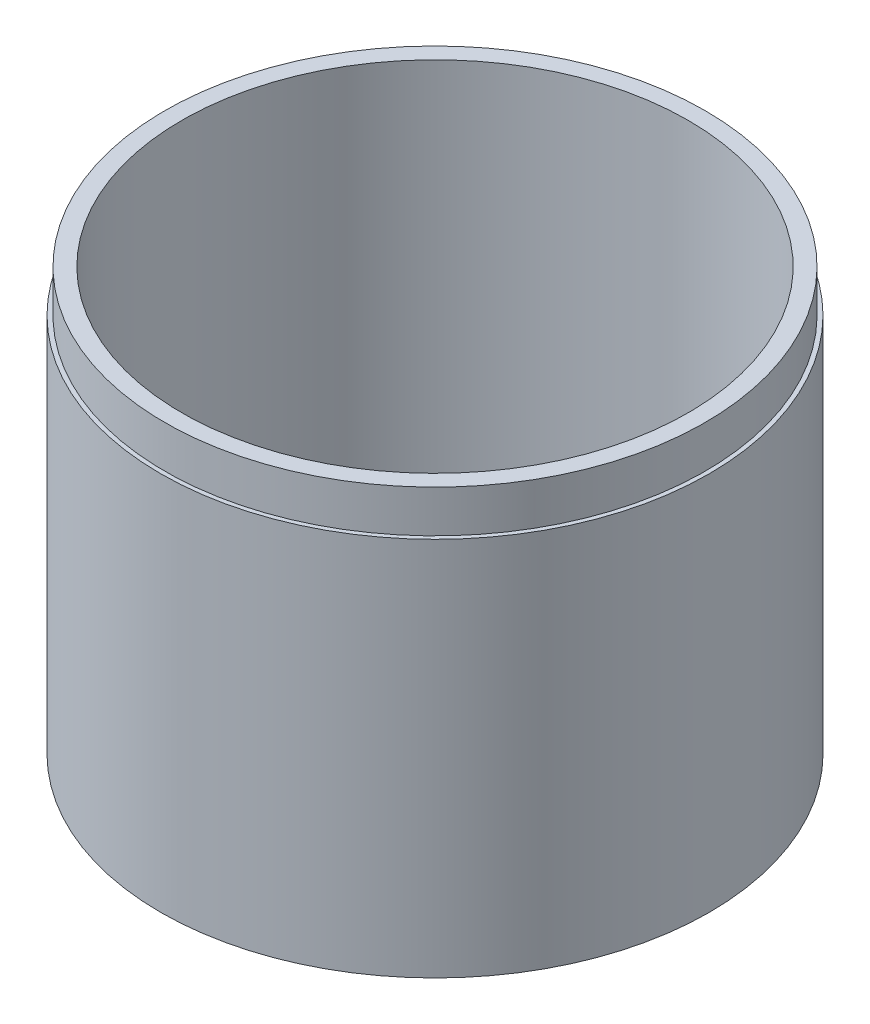
ISO-10303-21;
HEADER;
FILE_DESCRIPTION(('STEP AP214'),'2;1');
FILE_NAME('part.step','',(''),(''),'','','');
FILE_SCHEMA(('AUTOMOTIVE_DESIGN { 1 0 10303 214 1 1 1 1 }'));
ENDSEC;
DATA;
#1=APPLICATION_CONTEXT('core data for automotive mechanical design processes');
#2=APPLICATION_PROTOCOL_DEFINITION('international standard','automotive_design',2000,#1);
#3=PRODUCT_CONTEXT('',#1,'mechanical');
#4=PRODUCT('Part','Part','',(#3));
#5=PRODUCT_RELATED_PRODUCT_CATEGORY('part','',(#4));
#6=PRODUCT_DEFINITION_FORMATION('','',#4);
#7=PRODUCT_DEFINITION_CONTEXT('part definition',#1,'design');
#8=PRODUCT_DEFINITION('design','',#6,#7);
#9=PRODUCT_DEFINITION_SHAPE('','',#8);
#10=(LENGTH_UNIT() NAMED_UNIT(*) SI_UNIT(.MILLI.,.METRE.));
#11=(NAMED_UNIT(*) PLANE_ANGLE_UNIT() SI_UNIT($,.RADIAN.));
#12=(NAMED_UNIT(*) SI_UNIT($,.STERADIAN.) SOLID_ANGLE_UNIT());
#13=UNCERTAINTY_MEASURE_WITH_UNIT(LENGTH_MEASURE(1.E-05),#10,'distance_accuracy_value','');
#14=(GEOMETRIC_REPRESENTATION_CONTEXT(3) GLOBAL_UNCERTAINTY_ASSIGNED_CONTEXT((#13)) GLOBAL_UNIT_ASSIGNED_CONTEXT((#10,
#11,#12)) REPRESENTATION_CONTEXT('',''));
#15=CARTESIAN_POINT('',(0.,0.,0.));
#16=DIRECTION('',(0.,0.,1.));
#17=DIRECTION('',(1.,0.,0.));
#18=AXIS2_PLACEMENT_3D('',#15,#16,#17);
#19=CARTESIAN_POINT('',(0.,0.,0.));
#20=DIRECTION('',(0.,-1.,0.));
#21=DIRECTION('',(0.,0.,-1.));
#22=AXIS2_PLACEMENT_3D('',#19,#20,#21);
#23=CYLINDRICAL_SURFACE('',#22,64.);
#24=CARTESIAN_POINT('',(0.,100.,0.));
#25=DIRECTION('',(0.,-1.,0.));
#26=DIRECTION('',(0.,0.,-1.));
#27=AXIS2_PLACEMENT_3D('',#24,#25,#26);
#28=CIRCLE('',#27,64.);
#29=CARTESIAN_POINT('',(0.,100.,-64.));
#30=VERTEX_POINT('',#29);
#31=EDGE_CURVE('E67',#30,#30,#28,.T.);
#32=ORIENTED_EDGE('',*,*,#31,.T.);
#33=EDGE_LOOP('',(#32));
#34=FACE_BOUND('',#33,.T.);
#35=CARTESIAN_POINT('',(0.,90.,0.));
#36=DIRECTION('',(0.,-1.,0.));
#37=DIRECTION('',(0.,0.,-1.));
#38=AXIS2_PLACEMENT_3D('',#35,#36,#37);
#39=CIRCLE('',#38,64.);
#40=CARTESIAN_POINT('',(0.,90.,-64.));
#41=VERTEX_POINT('',#40);
#42=EDGE_CURVE('E10',#41,#41,#39,.T.);
#43=ORIENTED_EDGE('',*,*,#42,.F.);
#44=EDGE_LOOP('',(#43));
#45=FACE_BOUND('',#44,.T.);
#46=ADVANCED_FACE('F39',(#34,#45),#23,.T.);
#47=CARTESIAN_POINT('',(0.,90.,0.));
#48=DIRECTION('',(0.,1.,0.));
#49=DIRECTION('',(0.,0.,1.));
#50=AXIS2_PLACEMENT_3D('',#47,#48,#49);
#51=PLANE('',#50);
#52=ORIENTED_EDGE('',*,*,#42,.T.);
#53=EDGE_LOOP('',(#52));
#54=FACE_BOUND('',#53,.T.);
#55=CARTESIAN_POINT('',(0.,90.,0.));
#56=DIRECTION('',(0.,-1.,0.));
#57=DIRECTION('',(0.,0.,-1.));
#58=AXIS2_PLACEMENT_3D('',#55,#56,#57);
#59=CIRCLE('',#58,65.);
#60=CARTESIAN_POINT('',(0.,90.,-65.));
#61=VERTEX_POINT('',#60);
#62=EDGE_CURVE('E45',#61,#61,#59,.T.);
#63=ORIENTED_EDGE('',*,*,#62,.F.);
#64=EDGE_LOOP('',(#63));
#65=FACE_BOUND('',#64,.T.);
#66=ADVANCED_FACE('F103',(#54,#65),#51,.T.);
#67=CARTESIAN_POINT('',(0.,0.,0.));
#68=DIRECTION('',(0.,-1.,0.));
#69=DIRECTION('',(0.,0.,-1.));
#70=AXIS2_PLACEMENT_3D('',#67,#68,#69);
#71=CYLINDRICAL_SURFACE('',#70,65.);
#72=ORIENTED_EDGE('',*,*,#62,.T.);
#73=EDGE_LOOP('',(#72));
#74=FACE_BOUND('',#73,.T.);
#75=CARTESIAN_POINT('',(0.,0.,0.));
#76=DIRECTION('',(0.,-1.,0.));
#77=DIRECTION('',(0.,0.,-1.));
#78=AXIS2_PLACEMENT_3D('',#75,#76,#77);
#79=CIRCLE('',#78,65.);
#80=CARTESIAN_POINT('',(0.,0.,-65.));
#81=VERTEX_POINT('',#80);
#82=EDGE_CURVE('E49',#81,#81,#79,.T.);
#83=ORIENTED_EDGE('',*,*,#82,.F.);
#84=EDGE_LOOP('',(#83));
#85=FACE_BOUND('',#84,.T.);
#86=ADVANCED_FACE('F99',(#74,#85),#71,.T.);
#87=CARTESIAN_POINT('',(0.,0.,0.));
#88=DIRECTION('',(0.,-1.,0.));
#89=DIRECTION('',(0.,0.,-1.));
#90=AXIS2_PLACEMENT_3D('',#87,#88,#89);
#91=PLANE('',#90);
#92=ORIENTED_EDGE('',*,*,#82,.T.);
#93=EDGE_LOOP('',(#92));
#94=FACE_BOUND('',#93,.T.);
#95=CARTESIAN_POINT('',(0.,0.,0.));
#96=DIRECTION('',(0.,-1.,0.));
#97=DIRECTION('',(0.,0.,-1.));
#98=AXIS2_PLACEMENT_3D('',#95,#96,#97);
#99=CIRCLE('',#98,63.);
#100=CARTESIAN_POINT('',(0.,0.,-63.));
#101=VERTEX_POINT('',#100);
#102=EDGE_CURVE('E53',#101,#101,#99,.T.);
#103=ORIENTED_EDGE('',*,*,#102,.F.);
#104=EDGE_LOOP('',(#103));
#105=FACE_BOUND('',#104,.T.);
#106=ADVANCED_FACE('F93',(#94,#105),#91,.T.);
#107=CARTESIAN_POINT('',(0.,0.,0.));
#108=DIRECTION('',(0.,-1.,0.));
#109=DIRECTION('',(0.,0.,-1.));
#110=AXIS2_PLACEMENT_3D('',#107,#108,#109);
#111=CYLINDRICAL_SURFACE('',#110,63.);
#112=ORIENTED_EDGE('',*,*,#102,.T.);
#113=EDGE_LOOP('',(#112));
#114=FACE_BOUND('',#113,.T.);
#115=CARTESIAN_POINT('',(0.,9.99999999999997,0.));
#116=DIRECTION('',(0.,-1.,0.));
#117=DIRECTION('',(0.,0.,-1.));
#118=AXIS2_PLACEMENT_3D('',#115,#116,#117);
#119=CIRCLE('',#118,63.);
#120=CARTESIAN_POINT('',(0.,9.99999999999997,-63.));
#121=VERTEX_POINT('',#120);
#122=EDGE_CURVE('E58',#121,#121,#119,.T.);
#123=ORIENTED_EDGE('',*,*,#122,.F.);
#124=EDGE_LOOP('',(#123));
#125=FACE_BOUND('',#124,.T.);
#126=ADVANCED_FACE('F88',(#114,#125),#111,.F.);
#127=CARTESIAN_POINT('',(0.,9.99999999999997,0.));
#128=DIRECTION('',(0.,1.,0.));
#129=DIRECTION('',(0.,0.,1.));
#130=AXIS2_PLACEMENT_3D('',#127,#128,#129);
#131=PLANE('',#130);
#132=CARTESIAN_POINT('',(0.,9.99999999999997,0.));
#133=DIRECTION('',(0.,-1.,0.));
#134=DIRECTION('',(0.,0.,-1.));
#135=AXIS2_PLACEMENT_3D('',#132,#133,#134);
#136=CIRCLE('',#135,60.);
#137=CARTESIAN_POINT('',(0.,9.99999999999997,-60.));
#138=VERTEX_POINT('',#137);
#139=EDGE_CURVE('E61',#138,#138,#136,.T.);
#140=ORIENTED_EDGE('',*,*,#139,.F.);
#141=EDGE_LOOP('',(#140));
#142=FACE_BOUND('',#141,.T.);
#143=ORIENTED_EDGE('',*,*,#122,.T.);
#144=EDGE_LOOP('',(#143));
#145=FACE_BOUND('',#144,.T.);
#146=ADVANCED_FACE('F82',(#142,#145),#131,.F.);
#147=CARTESIAN_POINT('',(0.,0.,0.));
#148=DIRECTION('',(0.,-1.,0.));
#149=DIRECTION('',(0.,0.,-1.));
#150=AXIS2_PLACEMENT_3D('',#147,#148,#149);
#151=CYLINDRICAL_SURFACE('',#150,60.);
#152=CARTESIAN_POINT('',(0.,100.,0.));
#153=DIRECTION('',(0.,-1.,0.));
#154=DIRECTION('',(0.,0.,-1.));
#155=AXIS2_PLACEMENT_3D('',#152,#153,#154);
#156=CIRCLE('',#155,60.);
#157=CARTESIAN_POINT('',(0.,100.,-60.));
#158=VERTEX_POINT('',#157);
#159=EDGE_CURVE('E64',#158,#158,#156,.T.);
#160=ORIENTED_EDGE('',*,*,#159,.F.);
#161=EDGE_LOOP('',(#160));
#162=FACE_BOUND('',#161,.T.);
#163=ORIENTED_EDGE('',*,*,#139,.T.);
#164=EDGE_LOOP('',(#163));
#165=FACE_BOUND('',#164,.T.);
#166=ADVANCED_FACE('F76',(#162,#165),#151,.F.);
#167=CARTESIAN_POINT('',(6.93889390390719E-13,100.,0.));
#168=DIRECTION('',(0.,-1.,0.));
#169=DIRECTION('',(0.,0.,-1.));
#170=AXIS2_PLACEMENT_3D('',#167,#168,#169);
#171=PLANE('',#170);
#172=ORIENTED_EDGE('',*,*,#31,.F.);
#173=EDGE_LOOP('',(#172));
#174=FACE_BOUND('',#173,.T.);
#175=ORIENTED_EDGE('',*,*,#159,.T.);
#176=EDGE_LOOP('',(#175));
#177=FACE_BOUND('',#176,.T.);
#178=ADVANCED_FACE('F73',(#174,#177),#171,.F.);
#179=CLOSED_SHELL('',(#46,#66,#86,#106,#126,#146,#166,#178));
#180=MANIFOLD_SOLID_BREP('B2',#179);
#181=ADVANCED_BREP_SHAPE_REPRESENTATION('',(#18,#180),#14);
#182=SHAPE_DEFINITION_REPRESENTATION(#9,#181);
ENDSEC;
END-ISO-10303-21;
